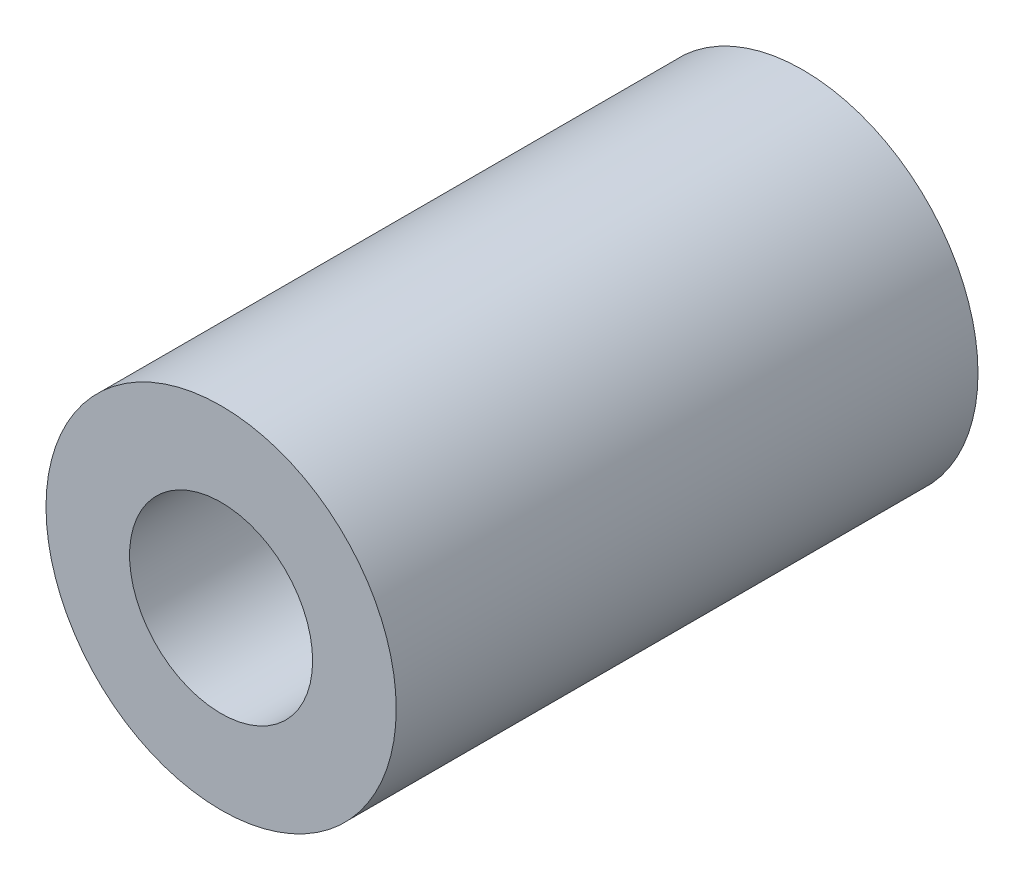
ISO-10303-21;
HEADER;
FILE_DESCRIPTION(('STEP AP214'),'2;1');
FILE_NAME('part.step','',(''),(''),'','','');
FILE_SCHEMA(('AUTOMOTIVE_DESIGN { 1 0 10303 214 1 1 1 1 }'));
ENDSEC;
DATA;
#1=APPLICATION_CONTEXT('core data for automotive mechanical design processes');
#2=APPLICATION_PROTOCOL_DEFINITION('international standard','automotive_design',2000,#1);
#3=PRODUCT_CONTEXT('',#1,'mechanical');
#4=PRODUCT('Part','Part','',(#3));
#5=PRODUCT_RELATED_PRODUCT_CATEGORY('part','',(#4));
#6=PRODUCT_DEFINITION_FORMATION('','',#4);
#7=PRODUCT_DEFINITION_CONTEXT('part definition',#1,'design');
#8=PRODUCT_DEFINITION('design','',#6,#7);
#9=PRODUCT_DEFINITION_SHAPE('','',#8);
#10=(LENGTH_UNIT() NAMED_UNIT(*) SI_UNIT(.MILLI.,.METRE.));
#11=(NAMED_UNIT(*) PLANE_ANGLE_UNIT() SI_UNIT($,.RADIAN.));
#12=(NAMED_UNIT(*) SI_UNIT($,.STERADIAN.) SOLID_ANGLE_UNIT());
#13=UNCERTAINTY_MEASURE_WITH_UNIT(LENGTH_MEASURE(1.E-05),#10,'distance_accuracy_value','');
#14=(GEOMETRIC_REPRESENTATION_CONTEXT(3) GLOBAL_UNCERTAINTY_ASSIGNED_CONTEXT((#13)) GLOBAL_UNIT_ASSIGNED_CONTEXT((#10,
#11,#12)) REPRESENTATION_CONTEXT('',''));
#15=CARTESIAN_POINT('',(0.,0.,0.));
#16=DIRECTION('',(0.,0.,1.));
#17=DIRECTION('',(1.,0.,0.));
#18=AXIS2_PLACEMENT_3D('',#15,#16,#17);
#19=CARTESIAN_POINT('',(0.,0.,7.9121));
#20=DIRECTION('',(0.,0.,1.));
#21=DIRECTION('',(1.,0.,0.));
#22=AXIS2_PLACEMENT_3D('',#19,#20,#21);
#23=PLANE('',#22);
#24=CARTESIAN_POINT('',(0.,0.,7.9121));
#25=DIRECTION('',(0.,0.,1.));
#26=DIRECTION('',(1.,0.,0.));
#27=AXIS2_PLACEMENT_3D('',#24,#25,#26);
#28=CIRCLE('',#27,4.7625);
#29=CARTESIAN_POINT('',(4.7625,0.,7.9121));
#30=VERTEX_POINT('',#29);
#31=EDGE_CURVE('E10',#30,#30,#28,.T.);
#32=ORIENTED_EDGE('',*,*,#31,.T.);
#33=EDGE_LOOP('',(#32));
#34=FACE_BOUND('',#33,.T.);
#35=CARTESIAN_POINT('',(0.,0.,7.9121));
#36=DIRECTION('',(0.,0.,1.));
#37=DIRECTION('',(1.,0.,0.));
#38=AXIS2_PLACEMENT_3D('',#35,#36,#37);
#39=CIRCLE('',#38,2.4892);
#40=CARTESIAN_POINT('',(2.4892,0.,7.9121));
#41=VERTEX_POINT('',#40);
#42=EDGE_CURVE('E46',#41,#41,#39,.T.);
#43=ORIENTED_EDGE('',*,*,#42,.F.);
#44=EDGE_LOOP('',(#43));
#45=FACE_BOUND('',#44,.T.);
#46=ADVANCED_FACE('F35',(#34,#45),#23,.T.);
#47=CARTESIAN_POINT('',(0.,0.,-7.9121));
#48=DIRECTION('',(0.,0.,1.));
#49=DIRECTION('',(1.,0.,0.));
#50=AXIS2_PLACEMENT_3D('',#47,#48,#49);
#51=PLANE('',#50);
#52=CARTESIAN_POINT('',(0.,0.,-7.9121));
#53=DIRECTION('',(0.,0.,1.));
#54=DIRECTION('',(1.,0.,0.));
#55=AXIS2_PLACEMENT_3D('',#52,#53,#54);
#56=CIRCLE('',#55,4.7625);
#57=CARTESIAN_POINT('',(4.7625,0.,-7.9121));
#58=VERTEX_POINT('',#57);
#59=EDGE_CURVE('E39',#58,#58,#56,.T.);
#60=ORIENTED_EDGE('',*,*,#59,.F.);
#61=EDGE_LOOP('',(#60));
#62=FACE_BOUND('',#61,.T.);
#63=CARTESIAN_POINT('',(0.,0.,-7.9121));
#64=DIRECTION('',(0.,0.,1.));
#65=DIRECTION('',(1.,0.,0.));
#66=AXIS2_PLACEMENT_3D('',#63,#64,#65);
#67=CIRCLE('',#66,2.4892);
#68=CARTESIAN_POINT('',(2.4892,0.,-7.9121));
#69=VERTEX_POINT('',#68);
#70=EDGE_CURVE('E48',#69,#69,#67,.T.);
#71=ORIENTED_EDGE('',*,*,#70,.T.);
#72=EDGE_LOOP('',(#71));
#73=FACE_BOUND('',#72,.T.);
#74=ADVANCED_FACE('F58',(#62,#73),#51,.F.);
#75=CARTESIAN_POINT('',(0.,0.,7.9121));
#76=DIRECTION('',(0.,0.,-1.));
#77=DIRECTION('',(-1.,0.,0.));
#78=AXIS2_PLACEMENT_3D('',#75,#76,#77);
#79=CYLINDRICAL_SURFACE('',#78,4.7625);
#80=ORIENTED_EDGE('',*,*,#31,.F.);
#81=EDGE_LOOP('',(#80));
#82=FACE_BOUND('',#81,.T.);
#83=ORIENTED_EDGE('',*,*,#59,.T.);
#84=EDGE_LOOP('',(#83));
#85=FACE_BOUND('',#84,.T.);
#86=ADVANCED_FACE('F37',(#82,#85),#79,.T.);
#87=CARTESIAN_POINT('',(0.,0.,7.9121));
#88=DIRECTION('',(0.,0.,-1.));
#89=DIRECTION('',(-1.,0.,0.));
#90=AXIS2_PLACEMENT_3D('',#87,#88,#89);
#91=CYLINDRICAL_SURFACE('',#90,2.4892);
#92=ORIENTED_EDGE('',*,*,#42,.T.);
#93=EDGE_LOOP('',(#92));
#94=FACE_BOUND('',#93,.T.);
#95=ORIENTED_EDGE('',*,*,#70,.F.);
#96=EDGE_LOOP('',(#95));
#97=FACE_BOUND('',#96,.T.);
#98=ADVANCED_FACE('F54',(#94,#97),#91,.F.);
#99=CLOSED_SHELL('',(#46,#74,#86,#98));
#100=MANIFOLD_SOLID_BREP('B2',#99);
#101=ADVANCED_BREP_SHAPE_REPRESENTATION('',(#18,#100),#14);
#102=SHAPE_DEFINITION_REPRESENTATION(#9,#101);
ENDSEC;
END-ISO-10303-21;
